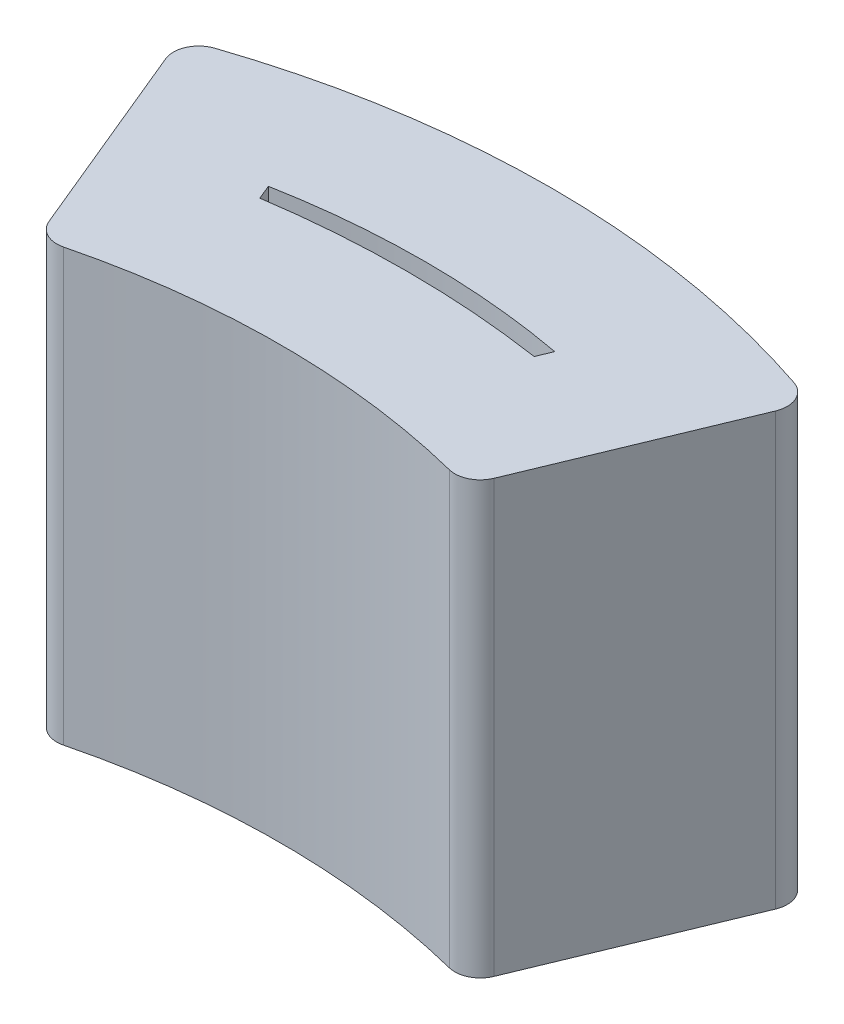
ISO-10303-21;
HEADER;
FILE_DESCRIPTION(('STEP AP214'),'2;1');
FILE_NAME('part.step','',(''),(''),'','','');
FILE_SCHEMA(('AUTOMOTIVE_DESIGN { 1 0 10303 214 1 1 1 1 }'));
ENDSEC;
DATA;
#1=APPLICATION_CONTEXT('core data for automotive mechanical design processes');
#2=APPLICATION_PROTOCOL_DEFINITION('international standard','automotive_design',2000,#1);
#3=PRODUCT_CONTEXT('',#1,'mechanical');
#4=PRODUCT('Part','Part','',(#3));
#5=PRODUCT_RELATED_PRODUCT_CATEGORY('part','',(#4));
#6=PRODUCT_DEFINITION_FORMATION('','',#4);
#7=PRODUCT_DEFINITION_CONTEXT('part definition',#1,'design');
#8=PRODUCT_DEFINITION('design','',#6,#7);
#9=PRODUCT_DEFINITION_SHAPE('','',#8);
#10=(LENGTH_UNIT() NAMED_UNIT(*) SI_UNIT(.MILLI.,.METRE.));
#11=(NAMED_UNIT(*) PLANE_ANGLE_UNIT() SI_UNIT($,.RADIAN.));
#12=(NAMED_UNIT(*) SI_UNIT($,.STERADIAN.) SOLID_ANGLE_UNIT());
#13=UNCERTAINTY_MEASURE_WITH_UNIT(LENGTH_MEASURE(1.E-05),#10,'distance_accuracy_value','');
#14=(GEOMETRIC_REPRESENTATION_CONTEXT(3) GLOBAL_UNCERTAINTY_ASSIGNED_CONTEXT((#13)) GLOBAL_UNIT_ASSIGNED_CONTEXT((#10,
#11,#12)) REPRESENTATION_CONTEXT('',''));
#15=CARTESIAN_POINT('',(0.,0.,0.));
#16=DIRECTION('',(0.,0.,1.));
#17=DIRECTION('',(1.,0.,0.));
#18=AXIS2_PLACEMENT_3D('',#15,#16,#17);
#19=CARTESIAN_POINT('',(55.9136967939758,42.5,-15.8827107145406));
#20=DIRECTION('',(0.,1.,0.));
#21=DIRECTION('',(0.,0.,1.));
#22=AXIS2_PLACEMENT_3D('',#19,#20,#21);
#23=PLANE('',#22);
#24=CARTESIAN_POINT('',(55.9136967939758,42.5,-15.8827107145406));
#25=DIRECTION('',(0.,1.,0.));
#26=DIRECTION('',(0.,0.,1.));
#27=AXIS2_PLACEMENT_3D('',#24,#25,#26);
#28=CIRCLE('',#27,4.99999999999999);
#29=CARTESIAN_POINT('',(60.5330944565323,42.5,-13.9692935527152));
#30=VERTEX_POINT('',#29);
#31=CARTESIAN_POINT('',(57.503646019909,42.5,-20.6231813092131));
#32=VERTEX_POINT('',#31);
#33=EDGE_CURVE('E158',#30,#32,#28,.T.);
#34=ORIENTED_EDGE('',*,*,#33,.T.);
#35=CARTESIAN_POINT('',(0.444031685331886,42.5,149.501385868501));
#36=DIRECTION('',(0.,1.,0.));
#37=DIRECTION('',(0.,0.,1.));
#38=AXIS2_PLACEMENT_3D('',#35,#36,#37);
#39=CIRCLE('',#38,179.438479556129);
#40=CARTESIAN_POINT('',(-56.6155826492452,42.5,-20.6231813092131));
#41=VERTEX_POINT('',#40);
#42=EDGE_CURVE('E161',#32,#41,#39,.T.);
#43=ORIENTED_EDGE('',*,*,#42,.T.);
#44=CARTESIAN_POINT('',(-55.025633423312,42.5,-15.8827107145406));
#45=DIRECTION('',(0.,1.,0.));
#46=DIRECTION('',(0.,0.,-1.));
#47=AXIS2_PLACEMENT_3D('',#44,#45,#46);
#48=CIRCLE('',#47,4.99999999999999);
#49=CARTESIAN_POINT('',(-59.6450310858685,42.5,-13.9692935527152));
#50=VERTEX_POINT('',#49);
#51=EDGE_CURVE('E164',#41,#50,#48,.T.);
#52=ORIENTED_EDGE('',*,*,#51,.T.);
#53=DIRECTION('',(0.382683432365091,0.,0.923879532511286));
#54=VECTOR('',#53,1.);
#55=CARTESIAN_POINT('',(-43.3938526316052,42.5,25.2645218761124));
#56=LINE('',#55,#54);
#57=CARTESIAN_POINT('',(-43.3938526316053,42.5,25.2645218761124));
#58=VERTEX_POINT('',#57);
#59=EDGE_CURVE('E166',#50,#58,#56,.T.);
#60=ORIENTED_EDGE('',*,*,#59,.T.);
#61=CARTESIAN_POINT('',(-38.7744549690488,42.5,23.351104714287));
#62=DIRECTION('',(0.,1.,0.));
#63=DIRECTION('',(0.,0.,-1.));
#64=AXIS2_PLACEMENT_3D('',#61,#62,#63);
#65=CIRCLE('',#64,5.00000000000001);
#66=CARTESIAN_POINT('',(-37.5564895449998,42.5,28.2004923277719));
#67=VERTEX_POINT('',#66);
#68=EDGE_CURVE('E168',#58,#67,#65,.T.);
#69=ORIENTED_EDGE('',*,*,#68,.T.);
#70=CARTESIAN_POINT('',(0.444031685331886,42.5,179.501385868501));
#71=DIRECTION('',(0.,-1.,0.));
#72=DIRECTION('',(0.,0.,-1.));
#73=AXIS2_PLACEMENT_3D('',#70,#71,#72);
#74=CIRCLE('',#73,156.);
#75=CARTESIAN_POINT('',(38.4445529156635,42.5,28.2004923277719));
#76=VERTEX_POINT('',#75);
#77=EDGE_CURVE('E170',#67,#76,#74,.T.);
#78=ORIENTED_EDGE('',*,*,#77,.T.);
#79=CARTESIAN_POINT('',(39.6625183397126,42.5,23.3511047142869));
#80=DIRECTION('',(0.,1.,0.));
#81=DIRECTION('',(0.,0.,-1.));
#82=AXIS2_PLACEMENT_3D('',#79,#80,#81);
#83=CIRCLE('',#82,5.00000000000002);
#84=CARTESIAN_POINT('',(44.281916002269,42.5,25.2645218761124));
#85=VERTEX_POINT('',#84);
#86=EDGE_CURVE('E172',#76,#85,#83,.T.);
#87=ORIENTED_EDGE('',*,*,#86,.T.);
#88=DIRECTION('',(0.382683432365091,0.,-0.923879532511286));
#89=VECTOR('',#88,1.);
#90=CARTESIAN_POINT('',(44.281916002269,42.5,25.2645218761124));
#91=LINE('',#90,#89);
#92=EDGE_CURVE('E174',#85,#30,#91,.T.);
#93=ORIENTED_EDGE('',*,*,#92,.T.);
#94=EDGE_LOOP('',(#34,#43,#52,#60,#69,#78,#87,#93));
#95=FACE_BOUND('',#94,.T.);
#96=DIRECTION('',(0.382683432365091,0.,-0.923879532511287));
#97=VECTOR('',#96,1.);
#98=CARTESIAN_POINT('',(27.4674592645195,42.5,0.530063132504199));
#99=LINE('',#98,#97);
#100=CARTESIAN_POINT('',(27.4674592645195,42.5,0.530063132504199));
#101=VERTEX_POINT('',#100);
#102=CARTESIAN_POINT('',(28.6556535015645,42.5,-2.33849150930335));
#103=VERTEX_POINT('',#102);
#104=EDGE_CURVE('E130',#101,#103,#99,.T.);
#105=ORIENTED_EDGE('',*,*,#104,.F.);
#106=CARTESIAN_POINT('',(0.444031685331886,42.5,179.501385868501));
#107=DIRECTION('',(0.,-1.,0.));
#108=DIRECTION('',(0.,0.,-1.));
#109=AXIS2_PLACEMENT_3D('',#106,#107,#108);
#110=CIRCLE('',#109,181.);
#111=CARTESIAN_POINT('',(-26.5793958938557,42.5,0.530063132504199));
#112=VERTEX_POINT('',#111);
#113=EDGE_CURVE('E122',#112,#101,#110,.T.);
#114=ORIENTED_EDGE('',*,*,#113,.F.);
#115=DIRECTION('',(0.382683432365091,0.,0.923879532511287));
#116=VECTOR('',#115,1.);
#117=CARTESIAN_POINT('',(-26.5793958938557,42.5,0.530063132504199));
#118=LINE('',#117,#116);
#119=CARTESIAN_POINT('',(-27.7675901309007,42.5,-2.33849150930335));
#120=VERTEX_POINT('',#119);
#121=EDGE_CURVE('E144',#120,#112,#118,.T.);
#122=ORIENTED_EDGE('',*,*,#121,.F.);
#123=CARTESIAN_POINT('',(0.444031685331886,42.5,149.501385868501));
#124=DIRECTION('',(0.,1.,0.));
#125=DIRECTION('',(0.,0.,1.));
#126=AXIS2_PLACEMENT_3D('',#123,#124,#125);
#127=CIRCLE('',#126,154.438479556129);
#128=EDGE_CURVE('E142',#103,#120,#127,.T.);
#129=ORIENTED_EDGE('',*,*,#128,.F.);
#130=EDGE_LOOP('',(#105,#114,#122,#129));
#131=FACE_BOUND('',#130,.T.);
#132=ADVANCED_FACE('F33',(#95,#131),#23,.T.);
#133=CARTESIAN_POINT('',(55.9136967939758,-42.5,-15.8827107145406));
#134=DIRECTION('',(0.,1.,0.));
#135=DIRECTION('',(0.,0.,1.));
#136=AXIS2_PLACEMENT_3D('',#133,#134,#135);
#137=PLANE('',#136);
#138=CARTESIAN_POINT('',(55.9136967939758,-42.5,-15.8827107145406));
#139=DIRECTION('',(0.,1.,0.));
#140=DIRECTION('',(0.,0.,1.));
#141=AXIS2_PLACEMENT_3D('',#138,#139,#140);
#142=CIRCLE('',#141,4.99999999999999);
#143=CARTESIAN_POINT('',(60.5330944565323,-42.5,-13.9692935527152));
#144=VERTEX_POINT('',#143);
#145=CARTESIAN_POINT('',(57.503646019909,-42.5,-20.6231813092131));
#146=VERTEX_POINT('',#145);
#147=EDGE_CURVE('E138',#144,#146,#142,.T.);
#148=ORIENTED_EDGE('',*,*,#147,.F.);
#149=DIRECTION('',(0.382683432365091,0.,-0.923879532511286));
#150=VECTOR('',#149,1.);
#151=CARTESIAN_POINT('',(44.281916002269,-42.5,25.2645218761124));
#152=LINE('',#151,#150);
#153=CARTESIAN_POINT('',(44.281916002269,-42.5,25.2645218761124));
#154=VERTEX_POINT('',#153);
#155=EDGE_CURVE('E162',#154,#144,#152,.T.);
#156=ORIENTED_EDGE('',*,*,#155,.F.);
#157=CARTESIAN_POINT('',(39.6625183397126,-42.5,23.3511047142869));
#158=DIRECTION('',(0.,1.,0.));
#159=DIRECTION('',(0.,0.,-1.));
#160=AXIS2_PLACEMENT_3D('',#157,#158,#159);
#161=CIRCLE('',#160,5.00000000000002);
#162=CARTESIAN_POINT('',(38.4445529156635,-42.5,28.2004923277719));
#163=VERTEX_POINT('',#162);
#164=EDGE_CURVE('E189',#163,#154,#161,.T.);
#165=ORIENTED_EDGE('',*,*,#164,.F.);
#166=CARTESIAN_POINT('',(0.444031685331886,-42.5,179.501385868501));
#167=DIRECTION('',(0.,-1.,0.));
#168=DIRECTION('',(0.,0.,-1.));
#169=AXIS2_PLACEMENT_3D('',#166,#167,#168);
#170=CIRCLE('',#169,156.);
#171=CARTESIAN_POINT('',(-37.5564895449998,-42.5,28.2004923277719));
#172=VERTEX_POINT('',#171);
#173=EDGE_CURVE('E187',#172,#163,#170,.T.);
#174=ORIENTED_EDGE('',*,*,#173,.F.);
#175=CARTESIAN_POINT('',(-38.7744549690488,-42.5,23.351104714287));
#176=DIRECTION('',(0.,1.,0.));
#177=DIRECTION('',(0.,0.,-1.));
#178=AXIS2_PLACEMENT_3D('',#175,#176,#177);
#179=CIRCLE('',#178,5.00000000000001);
#180=CARTESIAN_POINT('',(-43.3938526316053,-42.5,25.2645218761124));
#181=VERTEX_POINT('',#180);
#182=EDGE_CURVE('E185',#181,#172,#179,.T.);
#183=ORIENTED_EDGE('',*,*,#182,.F.);
#184=DIRECTION('',(0.382683432365091,0.,0.923879532511286));
#185=VECTOR('',#184,1.);
#186=CARTESIAN_POINT('',(-43.3938526316052,-42.5,25.2645218761124));
#187=LINE('',#186,#185);
#188=CARTESIAN_POINT('',(-59.6450310858685,-42.5,-13.9692935527152));
#189=VERTEX_POINT('',#188);
#190=EDGE_CURVE('E183',#189,#181,#187,.T.);
#191=ORIENTED_EDGE('',*,*,#190,.F.);
#192=CARTESIAN_POINT('',(-55.025633423312,-42.5,-15.8827107145406));
#193=DIRECTION('',(0.,1.,0.));
#194=DIRECTION('',(0.,0.,-1.));
#195=AXIS2_PLACEMENT_3D('',#192,#193,#194);
#196=CIRCLE('',#195,4.99999999999999);
#197=CARTESIAN_POINT('',(-56.6155826492452,-42.5,-20.6231813092131));
#198=VERTEX_POINT('',#197);
#199=EDGE_CURVE('E181',#198,#189,#196,.T.);
#200=ORIENTED_EDGE('',*,*,#199,.F.);
#201=CARTESIAN_POINT('',(0.444031685331886,-42.5,149.501385868501));
#202=DIRECTION('',(0.,1.,0.));
#203=DIRECTION('',(0.,0.,1.));
#204=AXIS2_PLACEMENT_3D('',#201,#202,#203);
#205=CIRCLE('',#204,179.438479556129);
#206=EDGE_CURVE('E179',#146,#198,#205,.T.);
#207=ORIENTED_EDGE('',*,*,#206,.F.);
#208=EDGE_LOOP('',(#148,#156,#165,#174,#183,#191,#200,#207));
#209=FACE_BOUND('',#208,.T.);
#210=CARTESIAN_POINT('',(0.444031685331886,-42.5,179.501385868501));
#211=DIRECTION('',(0.,-1.,0.));
#212=DIRECTION('',(0.,0.,-1.));
#213=AXIS2_PLACEMENT_3D('',#210,#211,#212);
#214=CIRCLE('',#213,181.);
#215=CARTESIAN_POINT('',(-26.5793958938557,-42.5,0.530063132504198));
#216=VERTEX_POINT('',#215);
#217=CARTESIAN_POINT('',(27.4674592645195,-42.5,0.530063132504199));
#218=VERTEX_POINT('',#217);
#219=EDGE_CURVE('E56',#216,#218,#214,.T.);
#220=ORIENTED_EDGE('',*,*,#219,.T.);
#221=DIRECTION('',(0.382683432365091,0.,-0.923879532511287));
#222=VECTOR('',#221,1.);
#223=CARTESIAN_POINT('',(27.4674592645195,-42.5,0.530063132504199));
#224=LINE('',#223,#222);
#225=CARTESIAN_POINT('',(28.6556535015645,-42.5,-2.33849150930335));
#226=VERTEX_POINT('',#225);
#227=EDGE_CURVE('E137',#218,#226,#224,.T.);
#228=ORIENTED_EDGE('',*,*,#227,.T.);
#229=CARTESIAN_POINT('',(0.444031685331886,-42.5,149.501385868501));
#230=DIRECTION('',(0.,1.,0.));
#231=DIRECTION('',(0.,0.,1.));
#232=AXIS2_PLACEMENT_3D('',#229,#230,#231);
#233=CIRCLE('',#232,154.438479556129);
#234=CARTESIAN_POINT('',(-27.7675901309007,-42.5,-2.33849150930335));
#235=VERTEX_POINT('',#234);
#236=EDGE_CURVE('E150',#226,#235,#233,.T.);
#237=ORIENTED_EDGE('',*,*,#236,.T.);
#238=DIRECTION('',(0.382683432365091,0.,0.923879532511287));
#239=VECTOR('',#238,1.);
#240=CARTESIAN_POINT('',(-26.5793958938557,-42.5,0.530063132504199));
#241=LINE('',#240,#239);
#242=EDGE_CURVE('E131',#235,#216,#241,.T.);
#243=ORIENTED_EDGE('',*,*,#242,.T.);
#244=EDGE_LOOP('',(#220,#228,#237,#243));
#245=FACE_BOUND('',#244,.T.);
#246=ADVANCED_FACE('F219',(#209,#245),#137,.F.);
#247=CARTESIAN_POINT('',(55.9136967939758,42.5,-15.8827107145406));
#248=DIRECTION('',(0.,-1.,0.));
#249=DIRECTION('',(0.,0.,-1.));
#250=AXIS2_PLACEMENT_3D('',#247,#248,#249);
#251=CYLINDRICAL_SURFACE('',#250,4.99999999999999);
#252=ORIENTED_EDGE('',*,*,#147,.T.);
#253=DIRECTION('',(0.,-1.,0.));
#254=VECTOR('',#253,1.);
#255=CARTESIAN_POINT('',(57.503646019909,42.5,-20.6231813092131));
#256=LINE('',#255,#254);
#257=EDGE_CURVE('E11',#32,#146,#256,.T.);
#258=ORIENTED_EDGE('',*,*,#257,.F.);
#259=ORIENTED_EDGE('',*,*,#33,.F.);
#260=DIRECTION('',(0.,-1.,0.));
#261=VECTOR('',#260,1.);
#262=CARTESIAN_POINT('',(60.5330944565323,42.5,-13.9692935527152));
#263=LINE('',#262,#261);
#264=EDGE_CURVE('E176',#30,#144,#263,.T.);
#265=ORIENTED_EDGE('',*,*,#264,.T.);
#266=EDGE_LOOP('',(#252,#258,#259,#265));
#267=FACE_BOUND('',#266,.T.);
#268=ADVANCED_FACE('F35',(#267),#251,.T.);
#269=CARTESIAN_POINT('',(0.444031685331886,42.5,149.501385868501));
#270=DIRECTION('',(0.,-1.,0.));
#271=DIRECTION('',(0.,0.,-1.));
#272=AXIS2_PLACEMENT_3D('',#269,#270,#271);
#273=CYLINDRICAL_SURFACE('',#272,179.438479556129);
#274=ORIENTED_EDGE('',*,*,#206,.T.);
#275=DIRECTION('',(0.,-1.,0.));
#276=VECTOR('',#275,1.);
#277=CARTESIAN_POINT('',(-56.6155826492452,42.5,-20.6231813092131));
#278=LINE('',#277,#276);
#279=EDGE_CURVE('E41',#41,#198,#278,.T.);
#280=ORIENTED_EDGE('',*,*,#279,.F.);
#281=ORIENTED_EDGE('',*,*,#42,.F.);
#282=ORIENTED_EDGE('',*,*,#257,.T.);
#283=EDGE_LOOP('',(#274,#280,#281,#282));
#284=FACE_BOUND('',#283,.T.);
#285=ADVANCED_FACE('F236',(#284),#273,.T.);
#286=CARTESIAN_POINT('',(-55.025633423312,42.5,-15.8827107145406));
#287=DIRECTION('',(0.,-1.,0.));
#288=DIRECTION('',(0.,0.,-1.));
#289=AXIS2_PLACEMENT_3D('',#286,#287,#288);
#290=CYLINDRICAL_SURFACE('',#289,4.99999999999999);
#291=ORIENTED_EDGE('',*,*,#199,.T.);
#292=DIRECTION('',(0.,-1.,0.));
#293=VECTOR('',#292,1.);
#294=CARTESIAN_POINT('',(-59.6450310858685,42.5,-13.9692935527152));
#295=LINE('',#294,#293);
#296=EDGE_CURVE('E206',#50,#189,#295,.T.);
#297=ORIENTED_EDGE('',*,*,#296,.F.);
#298=ORIENTED_EDGE('',*,*,#51,.F.);
#299=ORIENTED_EDGE('',*,*,#279,.T.);
#300=EDGE_LOOP('',(#291,#297,#298,#299));
#301=FACE_BOUND('',#300,.T.);
#302=ADVANCED_FACE('F213',(#301),#290,.T.);
#303=CARTESIAN_POINT('',(-43.3938526316052,42.5,25.2645218761124));
#304=DIRECTION('',(0.923879532511286,0.,-0.382683432365091));
#305=DIRECTION('',(-0.382683432365091,0.,-0.923879532511286));
#306=AXIS2_PLACEMENT_3D('',#303,#304,#305);
#307=PLANE('',#306);
#308=ORIENTED_EDGE('',*,*,#190,.T.);
#309=DIRECTION('',(0.,-1.,0.));
#310=VECTOR('',#309,1.);
#311=CARTESIAN_POINT('',(-43.3938526316053,42.5,25.2645218761124));
#312=LINE('',#311,#310);
#313=EDGE_CURVE('E203',#58,#181,#312,.T.);
#314=ORIENTED_EDGE('',*,*,#313,.F.);
#315=ORIENTED_EDGE('',*,*,#59,.F.);
#316=ORIENTED_EDGE('',*,*,#296,.T.);
#317=EDGE_LOOP('',(#308,#314,#315,#316));
#318=FACE_BOUND('',#317,.T.);
#319=ADVANCED_FACE('F225',(#318),#307,.F.);
#320=CARTESIAN_POINT('',(-38.7744549690488,42.5,23.351104714287));
#321=DIRECTION('',(0.,-1.,0.));
#322=DIRECTION('',(0.,0.,-1.));
#323=AXIS2_PLACEMENT_3D('',#320,#321,#322);
#324=CYLINDRICAL_SURFACE('',#323,5.00000000000001);
#325=ORIENTED_EDGE('',*,*,#182,.T.);
#326=DIRECTION('',(0.,-1.,0.));
#327=VECTOR('',#326,1.);
#328=CARTESIAN_POINT('',(-37.5564895449998,42.5,28.2004923277719));
#329=LINE('',#328,#327);
#330=EDGE_CURVE('E200',#67,#172,#329,.T.);
#331=ORIENTED_EDGE('',*,*,#330,.F.);
#332=ORIENTED_EDGE('',*,*,#68,.F.);
#333=ORIENTED_EDGE('',*,*,#313,.T.);
#334=EDGE_LOOP('',(#325,#331,#332,#333));
#335=FACE_BOUND('',#334,.T.);
#336=ADVANCED_FACE('F229',(#335),#324,.T.);
#337=CARTESIAN_POINT('',(0.444031685331886,42.5,179.501385868501));
#338=DIRECTION('',(0.,-1.,0.));
#339=DIRECTION('',(0.,0.,-1.));
#340=AXIS2_PLACEMENT_3D('',#337,#338,#339);
#341=CYLINDRICAL_SURFACE('',#340,156.);
#342=ORIENTED_EDGE('',*,*,#173,.T.);
#343=DIRECTION('',(0.,-1.,0.));
#344=VECTOR('',#343,1.);
#345=CARTESIAN_POINT('',(38.4445529156635,42.5,28.2004923277719));
#346=LINE('',#345,#344);
#347=EDGE_CURVE('E197',#76,#163,#346,.T.);
#348=ORIENTED_EDGE('',*,*,#347,.F.);
#349=ORIENTED_EDGE('',*,*,#77,.F.);
#350=ORIENTED_EDGE('',*,*,#330,.T.);
#351=EDGE_LOOP('',(#342,#348,#349,#350));
#352=FACE_BOUND('',#351,.T.);
#353=ADVANCED_FACE('F249',(#352),#341,.F.);
#354=CARTESIAN_POINT('',(39.6625183397126,42.5,23.3511047142869));
#355=DIRECTION('',(0.,-1.,0.));
#356=DIRECTION('',(0.,0.,-1.));
#357=AXIS2_PLACEMENT_3D('',#354,#355,#356);
#358=CYLINDRICAL_SURFACE('',#357,5.00000000000002);
#359=ORIENTED_EDGE('',*,*,#164,.T.);
#360=DIRECTION('',(0.,-1.,0.));
#361=VECTOR('',#360,1.);
#362=CARTESIAN_POINT('',(44.281916002269,42.5,25.2645218761124));
#363=LINE('',#362,#361);
#364=EDGE_CURVE('E194',#85,#154,#363,.T.);
#365=ORIENTED_EDGE('',*,*,#364,.F.);
#366=ORIENTED_EDGE('',*,*,#86,.F.);
#367=ORIENTED_EDGE('',*,*,#347,.T.);
#368=EDGE_LOOP('',(#359,#365,#366,#367));
#369=FACE_BOUND('',#368,.T.);
#370=ADVANCED_FACE('F247',(#369),#358,.T.);
#371=CARTESIAN_POINT('',(44.281916002269,42.5,25.2645218761124));
#372=DIRECTION('',(-0.923879532511286,0.,-0.382683432365091));
#373=DIRECTION('',(-0.382683432365091,0.,0.923879532511286));
#374=AXIS2_PLACEMENT_3D('',#371,#372,#373);
#375=PLANE('',#374);
#376=ORIENTED_EDGE('',*,*,#155,.T.);
#377=ORIENTED_EDGE('',*,*,#264,.F.);
#378=ORIENTED_EDGE('',*,*,#92,.F.);
#379=ORIENTED_EDGE('',*,*,#364,.T.);
#380=EDGE_LOOP('',(#376,#377,#378,#379));
#381=FACE_BOUND('',#380,.T.);
#382=ADVANCED_FACE('F242',(#381),#375,.F.);
#383=CARTESIAN_POINT('',(0.444031685331886,42.5,179.501385868501));
#384=DIRECTION('',(0.,-1.,0.));
#385=DIRECTION('',(0.,0.,-1.));
#386=AXIS2_PLACEMENT_3D('',#383,#384,#385);
#387=CYLINDRICAL_SURFACE('',#386,181.);
#388=ORIENTED_EDGE('',*,*,#219,.F.);
#389=DIRECTION('',(0.,-1.,0.));
#390=VECTOR('',#389,1.);
#391=CARTESIAN_POINT('',(-26.5793958938557,42.5,0.530063132504199));
#392=LINE('',#391,#390);
#393=EDGE_CURVE('E126',#112,#216,#392,.T.);
#394=ORIENTED_EDGE('',*,*,#393,.F.);
#395=ORIENTED_EDGE('',*,*,#113,.T.);
#396=DIRECTION('',(0.,-1.,0.));
#397=VECTOR('',#396,1.);
#398=CARTESIAN_POINT('',(27.4674592645195,42.5,0.530063132504199));
#399=LINE('',#398,#397);
#400=EDGE_CURVE('E125',#101,#218,#399,.T.);
#401=ORIENTED_EDGE('',*,*,#400,.T.);
#402=EDGE_LOOP('',(#388,#394,#395,#401));
#403=FACE_BOUND('',#402,.T.);
#404=ADVANCED_FACE('F124',(#403),#387,.T.);
#405=CARTESIAN_POINT('',(27.4674592645195,42.5,0.530063132504199));
#406=DIRECTION('',(-0.923879532511286,0.,-0.38268343236509));
#407=DIRECTION('',(-0.382683432365091,0.,0.923879532511287));
#408=AXIS2_PLACEMENT_3D('',#405,#406,#407);
#409=PLANE('',#408);
#410=ORIENTED_EDGE('',*,*,#227,.F.);
#411=ORIENTED_EDGE('',*,*,#400,.F.);
#412=ORIENTED_EDGE('',*,*,#104,.T.);
#413=DIRECTION('',(0.,-1.,0.));
#414=VECTOR('',#413,1.);
#415=CARTESIAN_POINT('',(28.6556535015645,42.5,-2.33849150930335));
#416=LINE('',#415,#414);
#417=EDGE_CURVE('E139',#103,#226,#416,.T.);
#418=ORIENTED_EDGE('',*,*,#417,.T.);
#419=EDGE_LOOP('',(#410,#411,#412,#418));
#420=FACE_BOUND('',#419,.T.);
#421=ADVANCED_FACE('F134',(#420),#409,.T.);
#422=CARTESIAN_POINT('',(0.444031685331886,42.5,149.501385868501));
#423=DIRECTION('',(0.,-1.,0.));
#424=DIRECTION('',(0.,0.,-1.));
#425=AXIS2_PLACEMENT_3D('',#422,#423,#424);
#426=CYLINDRICAL_SURFACE('',#425,154.438479556129);
#427=ORIENTED_EDGE('',*,*,#236,.F.);
#428=ORIENTED_EDGE('',*,*,#417,.F.);
#429=ORIENTED_EDGE('',*,*,#128,.T.);
#430=DIRECTION('',(0.,-1.,0.));
#431=VECTOR('',#430,1.);
#432=CARTESIAN_POINT('',(-27.7675901309007,42.5,-2.33849150930335));
#433=LINE('',#432,#431);
#434=EDGE_CURVE('E48',#120,#235,#433,.T.);
#435=ORIENTED_EDGE('',*,*,#434,.T.);
#436=EDGE_LOOP('',(#427,#428,#429,#435));
#437=FACE_BOUND('',#436,.T.);
#438=ADVANCED_FACE('F274',(#437),#426,.F.);
#439=CARTESIAN_POINT('',(-26.5793958938557,42.5,0.530063132504199));
#440=DIRECTION('',(0.923879532511286,0.,-0.38268343236509));
#441=DIRECTION('',(-0.382683432365091,0.,-0.923879532511287));
#442=AXIS2_PLACEMENT_3D('',#439,#440,#441);
#443=PLANE('',#442);
#444=ORIENTED_EDGE('',*,*,#242,.F.);
#445=ORIENTED_EDGE('',*,*,#434,.F.);
#446=ORIENTED_EDGE('',*,*,#121,.T.);
#447=ORIENTED_EDGE('',*,*,#393,.T.);
#448=EDGE_LOOP('',(#444,#445,#446,#447));
#449=FACE_BOUND('',#448,.T.);
#450=ADVANCED_FACE('F278',(#449),#443,.T.);
#451=CLOSED_SHELL('',(#132,#246,#268,#285,#302,#319,#336,#353,#370,#382,#404,#421,#438,#450));
#452=MANIFOLD_SOLID_BREP('B2',#451);
#453=ADVANCED_BREP_SHAPE_REPRESENTATION('',(#18,#452),#14);
#454=SHAPE_DEFINITION_REPRESENTATION(#9,#453);
ENDSEC;
END-ISO-10303-21;
